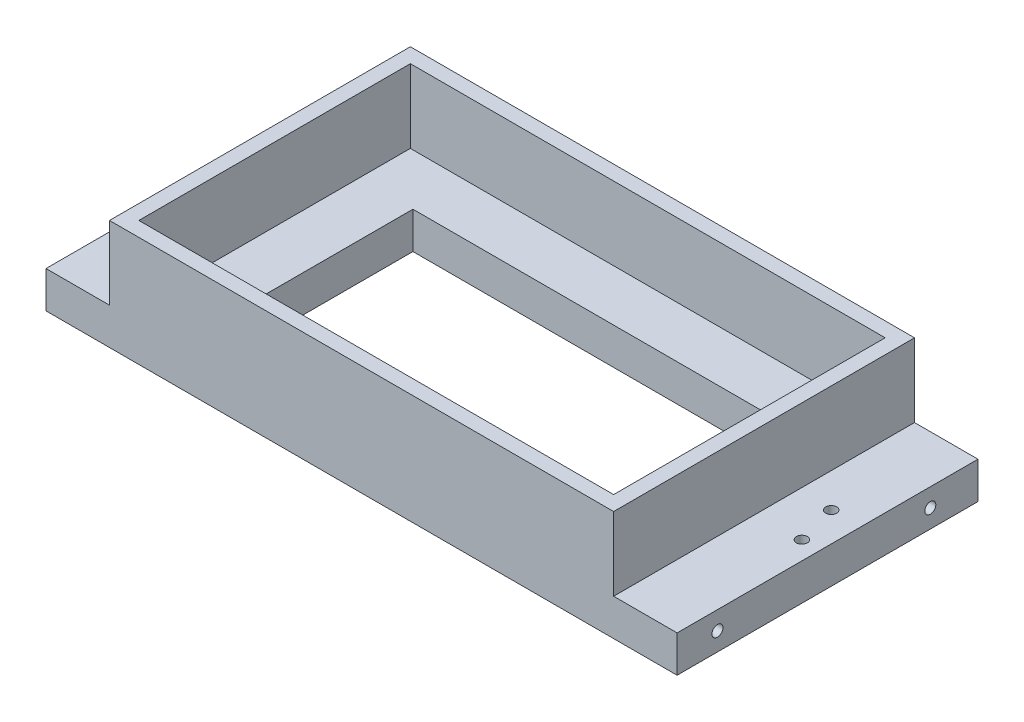
ISO-10303-21;
HEADER;
FILE_DESCRIPTION(('STEP AP214'),'2;1');
FILE_NAME('part.step','',(''),(''),'','','');
FILE_SCHEMA(('AUTOMOTIVE_DESIGN { 1 0 10303 214 1 1 1 1 }'));
ENDSEC;
DATA;
#1=APPLICATION_CONTEXT('core data for automotive mechanical design processes');
#2=APPLICATION_PROTOCOL_DEFINITION('international standard','automotive_design',2000,#1);
#3=PRODUCT_CONTEXT('',#1,'mechanical');
#4=PRODUCT('Part','Part','',(#3));
#5=PRODUCT_RELATED_PRODUCT_CATEGORY('part','',(#4));
#6=PRODUCT_DEFINITION_FORMATION('','',#4);
#7=PRODUCT_DEFINITION_CONTEXT('part definition',#1,'design');
#8=PRODUCT_DEFINITION('design','',#6,#7);
#9=PRODUCT_DEFINITION_SHAPE('','',#8);
#10=(LENGTH_UNIT() NAMED_UNIT(*) SI_UNIT(.MILLI.,.METRE.));
#11=(NAMED_UNIT(*) PLANE_ANGLE_UNIT() SI_UNIT($,.RADIAN.));
#12=(NAMED_UNIT(*) SI_UNIT($,.STERADIAN.) SOLID_ANGLE_UNIT());
#13=UNCERTAINTY_MEASURE_WITH_UNIT(LENGTH_MEASURE(1.E-05),#10,'distance_accuracy_value','');
#14=(GEOMETRIC_REPRESENTATION_CONTEXT(3) GLOBAL_UNCERTAINTY_ASSIGNED_CONTEXT((#13)) GLOBAL_UNIT_ASSIGNED_CONTEXT((#10,
#11,#12)) REPRESENTATION_CONTEXT('',''));
#15=CARTESIAN_POINT('',(0.,0.,0.));
#16=DIRECTION('',(0.,0.,1.));
#17=DIRECTION('',(1.,0.,0.));
#18=AXIS2_PLACEMENT_3D('',#15,#16,#17);
#19=CARTESIAN_POINT('',(0.,5.,0.));
#20=DIRECTION('',(0.,1.,0.));
#21=DIRECTION('',(0.,0.,1.));
#22=AXIS2_PLACEMENT_3D('',#19,#20,#21);
#23=PLANE('',#22);
#24=CARTESIAN_POINT('',(39.,5.,32.5));
#25=DIRECTION('',(0.,1.,0.));
#26=DIRECTION('',(0.,0.,1.));
#27=AXIS2_PLACEMENT_3D('',#24,#25,#26);
#28=CIRCLE('',#27,0.749999999999999);
#29=CARTESIAN_POINT('',(39.,5.,33.25));
#30=VERTEX_POINT('',#29);
#31=EDGE_CURVE('E419',#30,#30,#28,.T.);
#32=ORIENTED_EDGE('',*,*,#31,.F.);
#33=EDGE_LOOP('',(#32));
#34=FACE_BOUND('',#33,.T.);
#35=CARTESIAN_POINT('',(40.5,5.,38.));
#36=DIRECTION('',(0.,1.,0.));
#37=DIRECTION('',(0.,0.,1.));
#38=AXIS2_PLACEMENT_3D('',#35,#36,#37);
#39=CIRCLE('',#38,0.749999999999999);
#40=CARTESIAN_POINT('',(40.5,5.,38.75));
#41=VERTEX_POINT('',#40);
#42=EDGE_CURVE('E407',#41,#41,#39,.T.);
#43=ORIENTED_EDGE('',*,*,#42,.F.);
#44=EDGE_LOOP('',(#43));
#45=FACE_BOUND('',#44,.T.);
#46=DIRECTION('',(0.,0.,1.));
#47=VECTOR('',#46,1.);
#48=CARTESIAN_POINT('',(43.,5.,0.));
#49=LINE('',#48,#47);
#50=CARTESIAN_POINT('',(43.,5.,16.5));
#51=VERTEX_POINT('',#50);
#52=CARTESIAN_POINT('',(43.,5.,57.5));
#53=VERTEX_POINT('',#52);
#54=EDGE_CURVE('E140',#51,#53,#49,.T.);
#55=ORIENTED_EDGE('',*,*,#54,.F.);
#56=DIRECTION('',(-1.,0.,0.));
#57=VECTOR('',#56,1.);
#58=CARTESIAN_POINT('',(0.,5.,16.5));
#59=LINE('',#58,#57);
#60=CARTESIAN_POINT('',(34.35,5.,16.5));
#61=VERTEX_POINT('',#60);
#62=EDGE_CURVE('E379',#51,#61,#59,.T.);
#63=ORIENTED_EDGE('',*,*,#62,.T.);
#64=DIRECTION('',(0.,0.,1.));
#65=VECTOR('',#64,1.);
#66=CARTESIAN_POINT('',(34.35,5.,-57.5));
#67=LINE('',#66,#65);
#68=CARTESIAN_POINT('',(34.35,5.,57.5));
#69=VERTEX_POINT('',#68);
#70=EDGE_CURVE('E462',#61,#69,#67,.T.);
#71=ORIENTED_EDGE('',*,*,#70,.T.);
#72=DIRECTION('',(-1.,0.,0.));
#73=VECTOR('',#72,1.);
#74=CARTESIAN_POINT('',(0.,5.,57.5));
#75=LINE('',#74,#73);
#76=EDGE_CURVE('E371',#53,#69,#75,.T.);
#77=ORIENTED_EDGE('',*,*,#76,.F.);
#78=EDGE_LOOP('',(#55,#63,#71,#77));
#79=FACE_BOUND('',#78,.T.);
#80=ADVANCED_FACE('F131',(#34,#45,#79),#23,.T.);
#81=CARTESIAN_POINT('',(-39.,5.,32.5));
#82=DIRECTION('',(0.,1.,0.));
#83=DIRECTION('',(0.,0.,1.));
#84=AXIS2_PLACEMENT_3D('',#81,#82,#83);
#85=CIRCLE('',#84,0.750000000000014);
#86=CARTESIAN_POINT('',(-39.,5.,33.25));
#87=VERTEX_POINT('',#86);
#88=EDGE_CURVE('E425',#87,#87,#85,.T.);
#89=ORIENTED_EDGE('',*,*,#88,.F.);
#90=EDGE_LOOP('',(#89));
#91=FACE_BOUND('',#90,.T.);
#92=CARTESIAN_POINT('',(-40.5,5.,38.));
#93=DIRECTION('',(0.,1.,0.));
#94=DIRECTION('',(0.,0.,1.));
#95=AXIS2_PLACEMENT_3D('',#92,#93,#94);
#96=CIRCLE('',#95,0.750000000000014);
#97=CARTESIAN_POINT('',(-40.5,5.,38.75));
#98=VERTEX_POINT('',#97);
#99=EDGE_CURVE('E413',#98,#98,#96,.T.);
#100=ORIENTED_EDGE('',*,*,#99,.F.);
#101=EDGE_LOOP('',(#100));
#102=FACE_BOUND('',#101,.T.);
#103=DIRECTION('',(0.,0.,1.));
#104=VECTOR('',#103,1.);
#105=CARTESIAN_POINT('',(-34.35,5.,-57.5));
#106=LINE('',#105,#104);
#107=CARTESIAN_POINT('',(-34.35,5.,16.5));
#108=VERTEX_POINT('',#107);
#109=CARTESIAN_POINT('',(-34.35,5.,57.5));
#110=VERTEX_POINT('',#109);
#111=EDGE_CURVE('E453',#108,#110,#106,.T.);
#112=ORIENTED_EDGE('',*,*,#111,.F.);
#113=CARTESIAN_POINT('',(-43.,5.,16.5));
#114=VERTEX_POINT('',#113);
#115=EDGE_CURVE('E382',#108,#114,#59,.T.);
#116=ORIENTED_EDGE('',*,*,#115,.T.);
#117=DIRECTION('',(0.,0.,1.));
#118=VECTOR('',#117,1.);
#119=CARTESIAN_POINT('',(-43.,5.,0.));
#120=LINE('',#119,#118);
#121=CARTESIAN_POINT('',(-43.,5.,57.5));
#122=VERTEX_POINT('',#121);
#123=EDGE_CURVE('E12',#114,#122,#120,.T.);
#124=ORIENTED_EDGE('',*,*,#123,.T.);
#125=EDGE_CURVE('E252',#110,#122,#75,.T.);
#126=ORIENTED_EDGE('',*,*,#125,.F.);
#127=EDGE_LOOP('',(#112,#116,#124,#126));
#128=FACE_BOUND('',#127,.T.);
#129=ADVANCED_FACE('F334',(#91,#102,#128),#23,.T.);
#130=CARTESIAN_POINT('',(43.,5.,0.));
#131=DIRECTION('',(1.,0.,0.));
#132=DIRECTION('',(0.,0.,-1.));
#133=AXIS2_PLACEMENT_3D('',#130,#131,#132);
#134=PLANE('',#133);
#135=CARTESIAN_POINT('',(43.,2.5,52.));
#136=DIRECTION('',(1.,0.,0.));
#137=DIRECTION('',(0.,0.,-1.));
#138=AXIS2_PLACEMENT_3D('',#135,#136,#137);
#139=CIRCLE('',#138,0.749999999999999);
#140=CARTESIAN_POINT('',(43.,2.5,51.25));
#141=VERTEX_POINT('',#140);
#142=EDGE_CURVE('E362',#141,#141,#139,.T.);
#143=ORIENTED_EDGE('',*,*,#142,.F.);
#144=EDGE_LOOP('',(#143));
#145=FACE_BOUND('',#144,.T.);
#146=CARTESIAN_POINT('',(43.,2.5,23.));
#147=DIRECTION('',(1.,0.,0.));
#148=DIRECTION('',(0.,0.,-1.));
#149=AXIS2_PLACEMENT_3D('',#146,#147,#148);
#150=CIRCLE('',#149,0.750000000000002);
#151=CARTESIAN_POINT('',(43.,2.5,22.25));
#152=VERTEX_POINT('',#151);
#153=EDGE_CURVE('E366',#152,#152,#150,.T.);
#154=ORIENTED_EDGE('',*,*,#153,.F.);
#155=EDGE_LOOP('',(#154));
#156=FACE_BOUND('',#155,.T.);
#157=DIRECTION('',(0.,0.,1.));
#158=VECTOR('',#157,1.);
#159=CARTESIAN_POINT('',(43.,0.,0.));
#160=LINE('',#159,#158);
#161=CARTESIAN_POINT('',(43.,0.,16.5));
#162=VERTEX_POINT('',#161);
#163=CARTESIAN_POINT('',(43.,0.,57.5));
#164=VERTEX_POINT('',#163);
#165=EDGE_CURVE('E265',#162,#164,#160,.T.);
#166=ORIENTED_EDGE('',*,*,#165,.F.);
#167=DIRECTION('',(0.,1.,0.));
#168=VECTOR('',#167,1.);
#169=CARTESIAN_POINT('',(43.,5.,16.5));
#170=LINE('',#169,#168);
#171=EDGE_CURVE('E368',#162,#51,#170,.T.);
#172=ORIENTED_EDGE('',*,*,#171,.T.);
#173=ORIENTED_EDGE('',*,*,#54,.T.);
#174=DIRECTION('',(0.,1.,0.));
#175=VECTOR('',#174,1.);
#176=CARTESIAN_POINT('',(43.,5.,57.5));
#177=LINE('',#176,#175);
#178=EDGE_CURVE('E256',#164,#53,#177,.T.);
#179=ORIENTED_EDGE('',*,*,#178,.F.);
#180=EDGE_LOOP('',(#166,#172,#173,#179));
#181=FACE_BOUND('',#180,.T.);
#182=ADVANCED_FACE('F342',(#145,#156,#181),#134,.T.);
#183=CARTESIAN_POINT('',(-43.,5.,0.));
#184=DIRECTION('',(1.,0.,0.));
#185=DIRECTION('',(0.,0.,-1.));
#186=AXIS2_PLACEMENT_3D('',#183,#184,#185);
#187=PLANE('',#186);
#188=CARTESIAN_POINT('',(-43.,2.5,52.));
#189=DIRECTION('',(-1.,0.,0.));
#190=DIRECTION('',(0.,0.,1.));
#191=AXIS2_PLACEMENT_3D('',#188,#189,#190);
#192=CIRCLE('',#191,0.749999999999999);
#193=CARTESIAN_POINT('',(-43.,2.5,52.75));
#194=VERTEX_POINT('',#193);
#195=EDGE_CURVE('E402',#194,#194,#192,.T.);
#196=ORIENTED_EDGE('',*,*,#195,.F.);
#197=EDGE_LOOP('',(#196));
#198=FACE_BOUND('',#197,.T.);
#199=CARTESIAN_POINT('',(-43.,2.5,23.));
#200=DIRECTION('',(-1.,0.,0.));
#201=DIRECTION('',(0.,0.,1.));
#202=AXIS2_PLACEMENT_3D('',#199,#200,#201);
#203=CIRCLE('',#202,0.750000000000002);
#204=CARTESIAN_POINT('',(-43.,2.5,23.75));
#205=VERTEX_POINT('',#204);
#206=EDGE_CURVE('E395',#205,#205,#203,.T.);
#207=ORIENTED_EDGE('',*,*,#206,.F.);
#208=EDGE_LOOP('',(#207));
#209=FACE_BOUND('',#208,.T.);
#210=DIRECTION('',(0.,1.,0.));
#211=VECTOR('',#210,1.);
#212=CARTESIAN_POINT('',(-43.,5.,16.5));
#213=LINE('',#212,#211);
#214=CARTESIAN_POINT('',(-43.,0.,16.5));
#215=VERTEX_POINT('',#214);
#216=EDGE_CURVE('E270',#215,#114,#213,.T.);
#217=ORIENTED_EDGE('',*,*,#216,.F.);
#218=DIRECTION('',(0.,0.,1.));
#219=VECTOR('',#218,1.);
#220=CARTESIAN_POINT('',(-43.,0.,0.));
#221=LINE('',#220,#219);
#222=CARTESIAN_POINT('',(-43.,0.,57.5));
#223=VERTEX_POINT('',#222);
#224=EDGE_CURVE('E263',#215,#223,#221,.T.);
#225=ORIENTED_EDGE('',*,*,#224,.T.);
#226=DIRECTION('',(0.,1.,0.));
#227=VECTOR('',#226,1.);
#228=CARTESIAN_POINT('',(-43.,5.,57.5));
#229=LINE('',#228,#227);
#230=EDGE_CURVE('E246',#223,#122,#229,.T.);
#231=ORIENTED_EDGE('',*,*,#230,.T.);
#232=ORIENTED_EDGE('',*,*,#123,.F.);
#233=EDGE_LOOP('',(#217,#225,#231,#232));
#234=FACE_BOUND('',#233,.T.);
#235=ADVANCED_FACE('F269',(#198,#209,#234),#187,.F.);
#236=CARTESIAN_POINT('',(0.,0.,0.));
#237=DIRECTION('',(0.,1.,0.));
#238=DIRECTION('',(0.,0.,1.));
#239=AXIS2_PLACEMENT_3D('',#236,#237,#238);
#240=PLANE('',#239);
#241=DIRECTION('',(0.,0.,1.));
#242=VECTOR('',#241,1.);
#243=CARTESIAN_POINT('',(-25.,0.,25.5));
#244=LINE('',#243,#242);
#245=CARTESIAN_POINT('',(-25.,0.,25.5));
#246=VERTEX_POINT('',#245);
#247=CARTESIAN_POINT('',(-25.,0.,50.5));
#248=VERTEX_POINT('',#247);
#249=EDGE_CURVE('E288',#246,#248,#244,.T.);
#250=ORIENTED_EDGE('',*,*,#249,.T.);
#251=DIRECTION('',(1.,0.,0.));
#252=VECTOR('',#251,1.);
#253=CARTESIAN_POINT('',(-25.,0.,50.5));
#254=LINE('',#253,#252);
#255=CARTESIAN_POINT('',(25.,0.,50.5));
#256=VERTEX_POINT('',#255);
#257=EDGE_CURVE('E291',#248,#256,#254,.T.);
#258=ORIENTED_EDGE('',*,*,#257,.T.);
#259=DIRECTION('',(0.,0.,1.));
#260=VECTOR('',#259,1.);
#261=CARTESIAN_POINT('',(25.,0.,25.5));
#262=LINE('',#261,#260);
#263=CARTESIAN_POINT('',(25.,0.,25.5));
#264=VERTEX_POINT('',#263);
#265=EDGE_CURVE('E295',#264,#256,#262,.T.);
#266=ORIENTED_EDGE('',*,*,#265,.F.);
#267=DIRECTION('',(1.,0.,0.));
#268=VECTOR('',#267,1.);
#269=CARTESIAN_POINT('',(-25.,0.,25.5));
#270=LINE('',#269,#268);
#271=EDGE_CURVE('E279',#246,#264,#270,.T.);
#272=ORIENTED_EDGE('',*,*,#271,.F.);
#273=EDGE_LOOP('',(#250,#258,#266,#272));
#274=FACE_BOUND('',#273,.T.);
#275=CARTESIAN_POINT('',(40.5,0.,38.));
#276=DIRECTION('',(0.,1.,0.));
#277=DIRECTION('',(0.,0.,1.));
#278=AXIS2_PLACEMENT_3D('',#275,#276,#277);
#279=CIRCLE('',#278,0.749999999999999);
#280=CARTESIAN_POINT('',(40.5,0.,38.75));
#281=VERTEX_POINT('',#280);
#282=EDGE_CURVE('E398',#281,#281,#279,.T.);
#283=ORIENTED_EDGE('',*,*,#282,.T.);
#284=EDGE_LOOP('',(#283));
#285=FACE_BOUND('',#284,.T.);
#286=CARTESIAN_POINT('',(-40.5,0.,38.));
#287=DIRECTION('',(0.,1.,0.));
#288=DIRECTION('',(0.,0.,1.));
#289=AXIS2_PLACEMENT_3D('',#286,#287,#288);
#290=CIRCLE('',#289,0.750000000000014);
#291=CARTESIAN_POINT('',(-40.5,0.,38.75));
#292=VERTEX_POINT('',#291);
#293=EDGE_CURVE('E410',#292,#292,#290,.T.);
#294=ORIENTED_EDGE('',*,*,#293,.T.);
#295=EDGE_LOOP('',(#294));
#296=FACE_BOUND('',#295,.T.);
#297=CARTESIAN_POINT('',(-39.,0.,32.5));
#298=DIRECTION('',(0.,1.,0.));
#299=DIRECTION('',(0.,0.,1.));
#300=AXIS2_PLACEMENT_3D('',#297,#298,#299);
#301=CIRCLE('',#300,0.750000000000014);
#302=CARTESIAN_POINT('',(-39.,0.,33.25));
#303=VERTEX_POINT('',#302);
#304=EDGE_CURVE('E422',#303,#303,#301,.T.);
#305=ORIENTED_EDGE('',*,*,#304,.T.);
#306=EDGE_LOOP('',(#305));
#307=FACE_BOUND('',#306,.T.);
#308=CARTESIAN_POINT('',(39.,0.,32.5));
#309=DIRECTION('',(0.,1.,0.));
#310=DIRECTION('',(0.,0.,1.));
#311=AXIS2_PLACEMENT_3D('',#308,#309,#310);
#312=CIRCLE('',#311,0.749999999999999);
#313=CARTESIAN_POINT('',(39.,0.,33.25));
#314=VERTEX_POINT('',#313);
#315=EDGE_CURVE('E416',#314,#314,#312,.T.);
#316=ORIENTED_EDGE('',*,*,#315,.T.);
#317=EDGE_LOOP('',(#316));
#318=FACE_BOUND('',#317,.T.);
#319=DIRECTION('',(1.,0.,0.));
#320=VECTOR('',#319,1.);
#321=CARTESIAN_POINT('',(0.,0.,16.5));
#322=LINE('',#321,#320);
#323=EDGE_CURVE('E266',#215,#162,#322,.T.);
#324=ORIENTED_EDGE('',*,*,#323,.T.);
#325=ORIENTED_EDGE('',*,*,#165,.T.);
#326=DIRECTION('',(1.,0.,0.));
#327=VECTOR('',#326,1.);
#328=CARTESIAN_POINT('',(0.,0.,57.5));
#329=LINE('',#328,#327);
#330=EDGE_CURVE('E249',#223,#164,#329,.T.);
#331=ORIENTED_EDGE('',*,*,#330,.F.);
#332=ORIENTED_EDGE('',*,*,#224,.F.);
#333=EDGE_LOOP('',(#324,#325,#331,#332));
#334=FACE_BOUND('',#333,.T.);
#335=ADVANCED_FACE('F262',(#274,#285,#296,#307,#318,#334),#240,.F.);
#336=CARTESIAN_POINT('',(-34.35,15.,-57.5));
#337=DIRECTION('',(1.,0.,0.));
#338=DIRECTION('',(0.,0.,-1.));
#339=AXIS2_PLACEMENT_3D('',#336,#337,#338);
#340=PLANE('',#339);
#341=DIRECTION('',(0.,1.,0.));
#342=VECTOR('',#341,1.);
#343=CARTESIAN_POINT('',(-34.35,15.,16.5));
#344=LINE('',#343,#342);
#345=CARTESIAN_POINT('',(-34.35,15.,16.5));
#346=VERTEX_POINT('',#345);
#347=EDGE_CURVE('E148',#108,#346,#344,.T.);
#348=ORIENTED_EDGE('',*,*,#347,.F.);
#349=ORIENTED_EDGE('',*,*,#111,.T.);
#350=DIRECTION('',(0.,-1.,0.));
#351=VECTOR('',#350,1.);
#352=CARTESIAN_POINT('',(-34.35,15.,57.5));
#353=LINE('',#352,#351);
#354=CARTESIAN_POINT('',(-34.35,15.,57.5));
#355=VERTEX_POINT('',#354);
#356=EDGE_CURVE('E292',#355,#110,#353,.T.);
#357=ORIENTED_EDGE('',*,*,#356,.F.);
#358=DIRECTION('',(0.,0.,1.));
#359=VECTOR('',#358,1.);
#360=CARTESIAN_POINT('',(-34.35,15.,-57.5));
#361=LINE('',#360,#359);
#362=EDGE_CURVE('E459',#346,#355,#361,.T.);
#363=ORIENTED_EDGE('',*,*,#362,.F.);
#364=EDGE_LOOP('',(#348,#349,#357,#363));
#365=FACE_BOUND('',#364,.T.);
#366=ADVANCED_FACE('F348',(#365),#340,.F.);
#367=CARTESIAN_POINT('',(34.35,15.,-57.5));
#368=DIRECTION('',(1.,0.,0.));
#369=DIRECTION('',(0.,0.,-1.));
#370=AXIS2_PLACEMENT_3D('',#367,#368,#369);
#371=PLANE('',#370);
#372=ORIENTED_EDGE('',*,*,#70,.F.);
#373=DIRECTION('',(0.,1.,0.));
#374=VECTOR('',#373,1.);
#375=CARTESIAN_POINT('',(34.35,15.,16.5));
#376=LINE('',#375,#374);
#377=CARTESIAN_POINT('',(34.35,15.,16.5));
#378=VERTEX_POINT('',#377);
#379=EDGE_CURVE('E376',#61,#378,#376,.T.);
#380=ORIENTED_EDGE('',*,*,#379,.T.);
#381=DIRECTION('',(0.,0.,1.));
#382=VECTOR('',#381,1.);
#383=CARTESIAN_POINT('',(34.35,15.,-57.5));
#384=LINE('',#383,#382);
#385=CARTESIAN_POINT('',(34.35,15.,57.5));
#386=VERTEX_POINT('',#385);
#387=EDGE_CURVE('E465',#378,#386,#384,.T.);
#388=ORIENTED_EDGE('',*,*,#387,.T.);
#389=DIRECTION('',(0.,-1.,0.));
#390=VECTOR('',#389,1.);
#391=CARTESIAN_POINT('',(34.35,15.,57.5));
#392=LINE('',#391,#390);
#393=EDGE_CURVE('E467',#386,#69,#392,.T.);
#394=ORIENTED_EDGE('',*,*,#393,.T.);
#395=EDGE_LOOP('',(#372,#380,#388,#394));
#396=FACE_BOUND('',#395,.T.);
#397=ADVANCED_FACE('F489',(#396),#371,.T.);
#398=CARTESIAN_POINT('',(0.,15.,0.));
#399=DIRECTION('',(0.,1.,0.));
#400=DIRECTION('',(0.,0.,1.));
#401=AXIS2_PLACEMENT_3D('',#398,#399,#400);
#402=PLANE('',#401);
#403=DIRECTION('',(1.,0.,0.));
#404=VECTOR('',#403,1.);
#405=CARTESIAN_POINT('',(-32.35,15.,18.5));
#406=LINE('',#405,#404);
#407=CARTESIAN_POINT('',(-32.35,15.,18.5));
#408=VERTEX_POINT('',#407);
#409=CARTESIAN_POINT('',(32.35,15.,18.5));
#410=VERTEX_POINT('',#409);
#411=EDGE_CURVE('E431',#408,#410,#406,.T.);
#412=ORIENTED_EDGE('',*,*,#411,.T.);
#413=DIRECTION('',(0.,0.,1.));
#414=VECTOR('',#413,1.);
#415=CARTESIAN_POINT('',(32.35,15.,18.5));
#416=LINE('',#415,#414);
#417=CARTESIAN_POINT('',(32.35,15.,55.5));
#418=VERTEX_POINT('',#417);
#419=EDGE_CURVE('E434',#410,#418,#416,.T.);
#420=ORIENTED_EDGE('',*,*,#419,.T.);
#421=DIRECTION('',(1.,0.,0.));
#422=VECTOR('',#421,1.);
#423=CARTESIAN_POINT('',(-32.35,15.,55.5));
#424=LINE('',#423,#422);
#425=CARTESIAN_POINT('',(-32.35,15.,55.5));
#426=VERTEX_POINT('',#425);
#427=EDGE_CURVE('E438',#426,#418,#424,.T.);
#428=ORIENTED_EDGE('',*,*,#427,.F.);
#429=DIRECTION('',(0.,0.,1.));
#430=VECTOR('',#429,1.);
#431=CARTESIAN_POINT('',(-32.35,15.,18.5));
#432=LINE('',#431,#430);
#433=EDGE_CURVE('E441',#408,#426,#432,.T.);
#434=ORIENTED_EDGE('',*,*,#433,.F.);
#435=EDGE_LOOP('',(#412,#420,#428,#434));
#436=FACE_BOUND('',#435,.T.);
#437=ORIENTED_EDGE('',*,*,#387,.F.);
#438=DIRECTION('',(1.,0.,0.));
#439=VECTOR('',#438,1.);
#440=CARTESIAN_POINT('',(0.,15.,16.5));
#441=LINE('',#440,#439);
#442=EDGE_CURVE('E373',#346,#378,#441,.T.);
#443=ORIENTED_EDGE('',*,*,#442,.F.);
#444=ORIENTED_EDGE('',*,*,#362,.T.);
#445=DIRECTION('',(1.,0.,0.));
#446=VECTOR('',#445,1.);
#447=CARTESIAN_POINT('',(-34.35,15.,57.5));
#448=LINE('',#447,#446);
#449=EDGE_CURVE('E461',#355,#386,#448,.T.);
#450=ORIENTED_EDGE('',*,*,#449,.T.);
#451=EDGE_LOOP('',(#437,#443,#444,#450));
#452=FACE_BOUND('',#451,.T.);
#453=ADVANCED_FACE('F331',(#436,#452),#402,.T.);
#454=DIRECTION('',(0.,0.,1.));
#455=VECTOR('',#454,1.);
#456=CARTESIAN_POINT('',(32.35,5.,18.5));
#457=LINE('',#456,#455);
#458=CARTESIAN_POINT('',(32.35,5.,18.5));
#459=VERTEX_POINT('',#458);
#460=CARTESIAN_POINT('',(32.35,5.,55.5));
#461=VERTEX_POINT('',#460);
#462=EDGE_CURVE('E156',#459,#461,#457,.T.);
#463=ORIENTED_EDGE('',*,*,#462,.F.);
#464=DIRECTION('',(1.,0.,0.));
#465=VECTOR('',#464,1.);
#466=CARTESIAN_POINT('',(-32.35,5.,18.5));
#467=LINE('',#466,#465);
#468=CARTESIAN_POINT('',(-32.35,5.,18.5));
#469=VERTEX_POINT('',#468);
#470=EDGE_CURVE('E428',#469,#459,#467,.T.);
#471=ORIENTED_EDGE('',*,*,#470,.F.);
#472=DIRECTION('',(0.,0.,1.));
#473=VECTOR('',#472,1.);
#474=CARTESIAN_POINT('',(-32.35,5.,18.5));
#475=LINE('',#474,#473);
#476=CARTESIAN_POINT('',(-32.35,5.,55.5));
#477=VERTEX_POINT('',#476);
#478=EDGE_CURVE('E435',#469,#477,#475,.T.);
#479=ORIENTED_EDGE('',*,*,#478,.T.);
#480=DIRECTION('',(1.,0.,0.));
#481=VECTOR('',#480,1.);
#482=CARTESIAN_POINT('',(-32.35,5.,55.5));
#483=LINE('',#482,#481);
#484=EDGE_CURVE('E446',#477,#461,#483,.T.);
#485=ORIENTED_EDGE('',*,*,#484,.T.);
#486=EDGE_LOOP('',(#463,#471,#479,#485));
#487=FACE_BOUND('',#486,.T.);
#488=DIRECTION('',(1.,0.,0.));
#489=VECTOR('',#488,1.);
#490=CARTESIAN_POINT('',(-25.,5.,50.5));
#491=LINE('',#490,#489);
#492=CARTESIAN_POINT('',(-25.,5.,50.5));
#493=VERTEX_POINT('',#492);
#494=CARTESIAN_POINT('',(25.,5.,50.5));
#495=VERTEX_POINT('',#494);
#496=EDGE_CURVE('E278',#493,#495,#491,.T.);
#497=ORIENTED_EDGE('',*,*,#496,.F.);
#498=DIRECTION('',(0.,0.,1.));
#499=VECTOR('',#498,1.);
#500=CARTESIAN_POINT('',(-25.,5.,25.5));
#501=LINE('',#500,#499);
#502=CARTESIAN_POINT('',(-25.,5.,25.5));
#503=VERTEX_POINT('',#502);
#504=EDGE_CURVE('E276',#503,#493,#501,.T.);
#505=ORIENTED_EDGE('',*,*,#504,.F.);
#506=DIRECTION('',(1.,0.,0.));
#507=VECTOR('',#506,1.);
#508=CARTESIAN_POINT('',(-25.,5.,25.5));
#509=LINE('',#508,#507);
#510=CARTESIAN_POINT('',(25.,5.,25.5));
#511=VERTEX_POINT('',#510);
#512=EDGE_CURVE('E284',#503,#511,#509,.T.);
#513=ORIENTED_EDGE('',*,*,#512,.T.);
#514=DIRECTION('',(0.,0.,1.));
#515=VECTOR('',#514,1.);
#516=CARTESIAN_POINT('',(25.,5.,25.5));
#517=LINE('',#516,#515);
#518=EDGE_CURVE('E281',#511,#495,#517,.T.);
#519=ORIENTED_EDGE('',*,*,#518,.T.);
#520=EDGE_LOOP('',(#497,#505,#513,#519));
#521=FACE_BOUND('',#520,.T.);
#522=ADVANCED_FACE('F320',(#487,#521),#23,.T.);
#523=CARTESIAN_POINT('',(25.,5.,25.5));
#524=DIRECTION('',(1.,0.,0.));
#525=DIRECTION('',(0.,0.,-1.));
#526=AXIS2_PLACEMENT_3D('',#523,#524,#525);
#527=PLANE('',#526);
#528=ORIENTED_EDGE('',*,*,#265,.T.);
#529=DIRECTION('',(0.,-1.,0.));
#530=VECTOR('',#529,1.);
#531=CARTESIAN_POINT('',(25.,5.,50.5));
#532=LINE('',#531,#530);
#533=EDGE_CURVE('E303',#495,#256,#532,.T.);
#534=ORIENTED_EDGE('',*,*,#533,.F.);
#535=ORIENTED_EDGE('',*,*,#518,.F.);
#536=DIRECTION('',(0.,-1.,0.));
#537=VECTOR('',#536,1.);
#538=CARTESIAN_POINT('',(25.,5.,25.5));
#539=LINE('',#538,#537);
#540=EDGE_CURVE('E302',#511,#264,#539,.T.);
#541=ORIENTED_EDGE('',*,*,#540,.T.);
#542=EDGE_LOOP('',(#528,#534,#535,#541));
#543=FACE_BOUND('',#542,.T.);
#544=ADVANCED_FACE('F323',(#543),#527,.F.);
#545=CARTESIAN_POINT('',(-25.,5.,25.5));
#546=DIRECTION('',(0.,0.,-1.));
#547=DIRECTION('',(-1.,0.,0.));
#548=AXIS2_PLACEMENT_3D('',#545,#546,#547);
#549=PLANE('',#548);
#550=ORIENTED_EDGE('',*,*,#271,.T.);
#551=ORIENTED_EDGE('',*,*,#540,.F.);
#552=ORIENTED_EDGE('',*,*,#512,.F.);
#553=DIRECTION('',(0.,-1.,0.));
#554=VECTOR('',#553,1.);
#555=CARTESIAN_POINT('',(-25.,5.,25.5));
#556=LINE('',#555,#554);
#557=EDGE_CURVE('E287',#503,#246,#556,.T.);
#558=ORIENTED_EDGE('',*,*,#557,.T.);
#559=EDGE_LOOP('',(#550,#551,#552,#558));
#560=FACE_BOUND('',#559,.T.);
#561=ADVANCED_FACE('F317',(#560),#549,.F.);
#562=CARTESIAN_POINT('',(-25.,5.,25.5));
#563=DIRECTION('',(1.,0.,0.));
#564=DIRECTION('',(0.,0.,-1.));
#565=AXIS2_PLACEMENT_3D('',#562,#563,#564);
#566=PLANE('',#565);
#567=ORIENTED_EDGE('',*,*,#249,.F.);
#568=ORIENTED_EDGE('',*,*,#557,.F.);
#569=ORIENTED_EDGE('',*,*,#504,.T.);
#570=DIRECTION('',(0.,-1.,0.));
#571=VECTOR('',#570,1.);
#572=CARTESIAN_POINT('',(-25.,5.,50.5));
#573=LINE('',#572,#571);
#574=EDGE_CURVE('E135',#493,#248,#573,.T.);
#575=ORIENTED_EDGE('',*,*,#574,.T.);
#576=EDGE_LOOP('',(#567,#568,#569,#575));
#577=FACE_BOUND('',#576,.T.);
#578=ADVANCED_FACE('F133',(#577),#566,.T.);
#579=CARTESIAN_POINT('',(-25.,5.,50.5));
#580=DIRECTION('',(0.,0.,-1.));
#581=DIRECTION('',(-1.,0.,0.));
#582=AXIS2_PLACEMENT_3D('',#579,#580,#581);
#583=PLANE('',#582);
#584=ORIENTED_EDGE('',*,*,#257,.F.);
#585=ORIENTED_EDGE('',*,*,#574,.F.);
#586=ORIENTED_EDGE('',*,*,#496,.T.);
#587=ORIENTED_EDGE('',*,*,#533,.T.);
#588=EDGE_LOOP('',(#584,#585,#586,#587));
#589=FACE_BOUND('',#588,.T.);
#590=ADVANCED_FACE('F321',(#589),#583,.T.);
#591=CARTESIAN_POINT('',(-34.35,15.,57.5));
#592=DIRECTION('',(0.,0.,-1.));
#593=DIRECTION('',(-1.,0.,0.));
#594=AXIS2_PLACEMENT_3D('',#591,#592,#593);
#595=PLANE('',#594);
#596=ORIENTED_EDGE('',*,*,#76,.T.);
#597=ORIENTED_EDGE('',*,*,#393,.F.);
#598=ORIENTED_EDGE('',*,*,#449,.F.);
#599=ORIENTED_EDGE('',*,*,#356,.T.);
#600=ORIENTED_EDGE('',*,*,#125,.T.);
#601=ORIENTED_EDGE('',*,*,#230,.F.);
#602=ORIENTED_EDGE('',*,*,#330,.T.);
#603=ORIENTED_EDGE('',*,*,#178,.T.);
#604=EDGE_LOOP('',(#596,#597,#598,#599,#600,#601,#602,#603));
#605=FACE_BOUND('',#604,.T.);
#606=ADVANCED_FACE('F248',(#605),#595,.F.);
#607=CARTESIAN_POINT('',(-32.35,15.,18.5));
#608=DIRECTION('',(0.,0.,-1.));
#609=DIRECTION('',(-1.,0.,0.));
#610=AXIS2_PLACEMENT_3D('',#607,#608,#609);
#611=PLANE('',#610);
#612=ORIENTED_EDGE('',*,*,#470,.T.);
#613=DIRECTION('',(0.,-1.,0.));
#614=VECTOR('',#613,1.);
#615=CARTESIAN_POINT('',(32.35,15.,18.5));
#616=LINE('',#615,#614);
#617=EDGE_CURVE('E443',#410,#459,#616,.T.);
#618=ORIENTED_EDGE('',*,*,#617,.F.);
#619=ORIENTED_EDGE('',*,*,#411,.F.);
#620=DIRECTION('',(0.,-1.,0.));
#621=VECTOR('',#620,1.);
#622=CARTESIAN_POINT('',(-32.35,15.,18.5));
#623=LINE('',#622,#621);
#624=EDGE_CURVE('E451',#408,#469,#623,.T.);
#625=ORIENTED_EDGE('',*,*,#624,.T.);
#626=EDGE_LOOP('',(#612,#618,#619,#625));
#627=FACE_BOUND('',#626,.T.);
#628=ADVANCED_FACE('F500',(#627),#611,.F.);
#629=CARTESIAN_POINT('',(-32.35,15.,18.5));
#630=DIRECTION('',(1.,0.,0.));
#631=DIRECTION('',(0.,0.,-1.));
#632=AXIS2_PLACEMENT_3D('',#629,#630,#631);
#633=PLANE('',#632);
#634=ORIENTED_EDGE('',*,*,#478,.F.);
#635=ORIENTED_EDGE('',*,*,#624,.F.);
#636=ORIENTED_EDGE('',*,*,#433,.T.);
#637=DIRECTION('',(0.,-1.,0.));
#638=VECTOR('',#637,1.);
#639=CARTESIAN_POINT('',(-32.35,15.,55.5));
#640=LINE('',#639,#638);
#641=EDGE_CURVE('E454',#426,#477,#640,.T.);
#642=ORIENTED_EDGE('',*,*,#641,.T.);
#643=EDGE_LOOP('',(#634,#635,#636,#642));
#644=FACE_BOUND('',#643,.T.);
#645=ADVANCED_FACE('F507',(#644),#633,.T.);
#646=CARTESIAN_POINT('',(-32.35,15.,55.5));
#647=DIRECTION('',(0.,0.,-1.));
#648=DIRECTION('',(-1.,0.,0.));
#649=AXIS2_PLACEMENT_3D('',#646,#647,#648);
#650=PLANE('',#649);
#651=ORIENTED_EDGE('',*,*,#484,.F.);
#652=ORIENTED_EDGE('',*,*,#641,.F.);
#653=ORIENTED_EDGE('',*,*,#427,.T.);
#654=DIRECTION('',(0.,-1.,0.));
#655=VECTOR('',#654,1.);
#656=CARTESIAN_POINT('',(32.35,15.,55.5));
#657=LINE('',#656,#655);
#658=EDGE_CURVE('E456',#418,#461,#657,.T.);
#659=ORIENTED_EDGE('',*,*,#658,.T.);
#660=EDGE_LOOP('',(#651,#652,#653,#659));
#661=FACE_BOUND('',#660,.T.);
#662=ADVANCED_FACE('F512',(#661),#650,.T.);
#663=CARTESIAN_POINT('',(32.35,15.,18.5));
#664=DIRECTION('',(1.,0.,0.));
#665=DIRECTION('',(0.,0.,-1.));
#666=AXIS2_PLACEMENT_3D('',#663,#664,#665);
#667=PLANE('',#666);
#668=ORIENTED_EDGE('',*,*,#462,.T.);
#669=ORIENTED_EDGE('',*,*,#658,.F.);
#670=ORIENTED_EDGE('',*,*,#419,.F.);
#671=ORIENTED_EDGE('',*,*,#617,.T.);
#672=EDGE_LOOP('',(#668,#669,#670,#671));
#673=FACE_BOUND('',#672,.T.);
#674=ADVANCED_FACE('F519',(#673),#667,.F.);
#675=CARTESIAN_POINT('',(40.5,0.,38.));
#676=DIRECTION('',(0.,1.,0.));
#677=DIRECTION('',(0.,0.,1.));
#678=AXIS2_PLACEMENT_3D('',#675,#676,#677);
#679=CYLINDRICAL_SURFACE('',#678,0.749999999999999);
#680=ORIENTED_EDGE('',*,*,#282,.F.);
#681=EDGE_LOOP('',(#680));
#682=FACE_BOUND('',#681,.T.);
#683=ORIENTED_EDGE('',*,*,#42,.T.);
#684=EDGE_LOOP('',(#683));
#685=FACE_BOUND('',#684,.T.);
#686=ADVANCED_FACE('F530',(#682,#685),#679,.F.);
#687=CARTESIAN_POINT('',(-40.5,0.,38.));
#688=DIRECTION('',(0.,1.,0.));
#689=DIRECTION('',(0.,0.,1.));
#690=AXIS2_PLACEMENT_3D('',#687,#688,#689);
#691=CYLINDRICAL_SURFACE('',#690,0.750000000000014);
#692=ORIENTED_EDGE('',*,*,#293,.F.);
#693=EDGE_LOOP('',(#692));
#694=FACE_BOUND('',#693,.T.);
#695=ORIENTED_EDGE('',*,*,#99,.T.);
#696=EDGE_LOOP('',(#695));
#697=FACE_BOUND('',#696,.T.);
#698=ADVANCED_FACE('F536',(#694,#697),#691,.F.);
#699=CARTESIAN_POINT('',(-39.,0.,32.5));
#700=DIRECTION('',(0.,1.,0.));
#701=DIRECTION('',(0.,0.,1.));
#702=AXIS2_PLACEMENT_3D('',#699,#700,#701);
#703=CYLINDRICAL_SURFACE('',#702,0.750000000000014);
#704=ORIENTED_EDGE('',*,*,#304,.F.);
#705=EDGE_LOOP('',(#704));
#706=FACE_BOUND('',#705,.T.);
#707=ORIENTED_EDGE('',*,*,#88,.T.);
#708=EDGE_LOOP('',(#707));
#709=FACE_BOUND('',#708,.T.);
#710=ADVANCED_FACE('F532',(#706,#709),#703,.F.);
#711=CARTESIAN_POINT('',(39.,0.,32.5));
#712=DIRECTION('',(0.,1.,0.));
#713=DIRECTION('',(0.,0.,1.));
#714=AXIS2_PLACEMENT_3D('',#711,#712,#713);
#715=CYLINDRICAL_SURFACE('',#714,0.749999999999999);
#716=ORIENTED_EDGE('',*,*,#315,.F.);
#717=EDGE_LOOP('',(#716));
#718=FACE_BOUND('',#717,.T.);
#719=ORIENTED_EDGE('',*,*,#31,.T.);
#720=EDGE_LOOP('',(#719));
#721=FACE_BOUND('',#720,.T.);
#722=ADVANCED_FACE('F535',(#718,#721),#715,.F.);
#723=CARTESIAN_POINT('',(-41.,2.5,52.));
#724=DIRECTION('',(-1.,0.,0.));
#725=DIRECTION('',(0.,0.,1.));
#726=AXIS2_PLACEMENT_3D('',#723,#724,#725);
#727=CYLINDRICAL_SURFACE('',#726,0.749999999999999);
#728=CARTESIAN_POINT('',(-41.,2.5,52.));
#729=DIRECTION('',(-1.,0.,0.));
#730=DIRECTION('',(0.,0.,1.));
#731=AXIS2_PLACEMENT_3D('',#728,#729,#730);
#732=CIRCLE('',#731,0.749999999999999);
#733=CARTESIAN_POINT('',(-41.,2.5,52.75));
#734=VERTEX_POINT('',#733);
#735=EDGE_CURVE('E388',#734,#734,#732,.T.);
#736=ORIENTED_EDGE('',*,*,#735,.F.);
#737=EDGE_LOOP('',(#736));
#738=FACE_BOUND('',#737,.T.);
#739=ORIENTED_EDGE('',*,*,#195,.T.);
#740=EDGE_LOOP('',(#739));
#741=FACE_BOUND('',#740,.T.);
#742=ADVANCED_FACE('F540',(#738,#741),#727,.F.);
#743=CARTESIAN_POINT('',(-41.,2.5,52.));
#744=DIRECTION('',(-1.,0.,0.));
#745=DIRECTION('',(0.,0.,1.));
#746=AXIS2_PLACEMENT_3D('',#743,#744,#745);
#747=PLANE('',#746);
#748=ORIENTED_EDGE('',*,*,#735,.T.);
#749=EDGE_LOOP('',(#748));
#750=FACE_BOUND('',#749,.T.);
#751=ADVANCED_FACE('F548',(#750),#747,.T.);
#752=CARTESIAN_POINT('',(-41.,2.5,23.));
#753=DIRECTION('',(-1.,0.,0.));
#754=DIRECTION('',(0.,0.,1.));
#755=AXIS2_PLACEMENT_3D('',#752,#753,#754);
#756=CYLINDRICAL_SURFACE('',#755,0.750000000000002);
#757=CARTESIAN_POINT('',(-41.,2.5,23.));
#758=DIRECTION('',(-1.,0.,0.));
#759=DIRECTION('',(0.,0.,1.));
#760=AXIS2_PLACEMENT_3D('',#757,#758,#759);
#761=CIRCLE('',#760,0.750000000000002);
#762=CARTESIAN_POINT('',(-41.,2.5,23.75));
#763=VERTEX_POINT('',#762);
#764=EDGE_CURVE('E399',#763,#763,#761,.T.);
#765=ORIENTED_EDGE('',*,*,#764,.F.);
#766=EDGE_LOOP('',(#765));
#767=FACE_BOUND('',#766,.T.);
#768=ORIENTED_EDGE('',*,*,#206,.T.);
#769=EDGE_LOOP('',(#768));
#770=FACE_BOUND('',#769,.T.);
#771=ADVANCED_FACE('F551',(#767,#770),#756,.F.);
#772=CARTESIAN_POINT('',(-41.,2.5,23.));
#773=DIRECTION('',(-1.,0.,0.));
#774=DIRECTION('',(0.,0.,1.));
#775=AXIS2_PLACEMENT_3D('',#772,#773,#774);
#776=PLANE('',#775);
#777=ORIENTED_EDGE('',*,*,#764,.T.);
#778=EDGE_LOOP('',(#777));
#779=FACE_BOUND('',#778,.T.);
#780=ADVANCED_FACE('F556',(#779),#776,.T.);
#781=CARTESIAN_POINT('',(41.,2.5,52.));
#782=DIRECTION('',(1.,0.,0.));
#783=DIRECTION('',(0.,0.,-1.));
#784=AXIS2_PLACEMENT_3D('',#781,#782,#783);
#785=CYLINDRICAL_SURFACE('',#784,0.749999999999999);
#786=CARTESIAN_POINT('',(41.,2.5,52.));
#787=DIRECTION('',(1.,0.,0.));
#788=DIRECTION('',(0.,0.,-1.));
#789=AXIS2_PLACEMENT_3D('',#786,#787,#788);
#790=CIRCLE('',#789,0.749999999999999);
#791=CARTESIAN_POINT('',(41.,2.5,51.25));
#792=VERTEX_POINT('',#791);
#793=EDGE_CURVE('E386',#792,#792,#790,.T.);
#794=ORIENTED_EDGE('',*,*,#793,.F.);
#795=EDGE_LOOP('',(#794));
#796=FACE_BOUND('',#795,.T.);
#797=ORIENTED_EDGE('',*,*,#142,.T.);
#798=EDGE_LOOP('',(#797));
#799=FACE_BOUND('',#798,.T.);
#800=ADVANCED_FACE('F559',(#796,#799),#785,.F.);
#801=CARTESIAN_POINT('',(41.,2.5,52.));
#802=DIRECTION('',(1.,0.,0.));
#803=DIRECTION('',(0.,0.,-1.));
#804=AXIS2_PLACEMENT_3D('',#801,#802,#803);
#805=PLANE('',#804);
#806=ORIENTED_EDGE('',*,*,#793,.T.);
#807=EDGE_LOOP('',(#806));
#808=FACE_BOUND('',#807,.T.);
#809=ADVANCED_FACE('F564',(#808),#805,.T.);
#810=CARTESIAN_POINT('',(41.,2.5,23.));
#811=DIRECTION('',(1.,0.,0.));
#812=DIRECTION('',(0.,0.,-1.));
#813=AXIS2_PLACEMENT_3D('',#810,#811,#812);
#814=CYLINDRICAL_SURFACE('',#813,0.750000000000002);
#815=CARTESIAN_POINT('',(41.,2.5,23.));
#816=DIRECTION('',(1.,0.,0.));
#817=DIRECTION('',(0.,0.,-1.));
#818=AXIS2_PLACEMENT_3D('',#815,#816,#817);
#819=CIRCLE('',#818,0.750000000000002);
#820=CARTESIAN_POINT('',(41.,2.5,22.25));
#821=VERTEX_POINT('',#820);
#822=EDGE_CURVE('E389',#821,#821,#819,.T.);
#823=ORIENTED_EDGE('',*,*,#822,.F.);
#824=EDGE_LOOP('',(#823));
#825=FACE_BOUND('',#824,.T.);
#826=ORIENTED_EDGE('',*,*,#153,.T.);
#827=EDGE_LOOP('',(#826));
#828=FACE_BOUND('',#827,.T.);
#829=ADVANCED_FACE('F567',(#825,#828),#814,.F.);
#830=CARTESIAN_POINT('',(41.,2.5,23.));
#831=DIRECTION('',(1.,0.,0.));
#832=DIRECTION('',(0.,0.,-1.));
#833=AXIS2_PLACEMENT_3D('',#830,#831,#832);
#834=PLANE('',#833);
#835=ORIENTED_EDGE('',*,*,#822,.T.);
#836=EDGE_LOOP('',(#835));
#837=FACE_BOUND('',#836,.T.);
#838=ADVANCED_FACE('F572',(#837),#834,.T.);
#839=CARTESIAN_POINT('',(0.,15.,16.5));
#840=DIRECTION('',(0.,0.,-1.));
#841=DIRECTION('',(-1.,0.,0.));
#842=AXIS2_PLACEMENT_3D('',#839,#840,#841);
#843=PLANE('',#842);
#844=ORIENTED_EDGE('',*,*,#216,.T.);
#845=ORIENTED_EDGE('',*,*,#115,.F.);
#846=ORIENTED_EDGE('',*,*,#347,.T.);
#847=ORIENTED_EDGE('',*,*,#442,.T.);
#848=ORIENTED_EDGE('',*,*,#379,.F.);
#849=ORIENTED_EDGE('',*,*,#62,.F.);
#850=ORIENTED_EDGE('',*,*,#171,.F.);
#851=ORIENTED_EDGE('',*,*,#323,.F.);
#852=EDGE_LOOP('',(#844,#845,#846,#847,#848,#849,#850,#851));
#853=FACE_BOUND('',#852,.T.);
#854=ADVANCED_FACE('F482',(#853),#843,.T.);
#855=CLOSED_SHELL('',(#80,#129,#182,#235,#335,#366,#397,#453,#522,#544,#561,#578,#590,#606,#628,
#645,#662,#674,#686,#698,#710,#722,#742,#751,#771,#780,#800,#809,#829,#838,#854));
#856=MANIFOLD_SOLID_BREP('B2',#855);
#857=ADVANCED_BREP_SHAPE_REPRESENTATION('',(#18,#856),#14);
#858=SHAPE_DEFINITION_REPRESENTATION(#9,#857);
ENDSEC;
END-ISO-10303-21;
